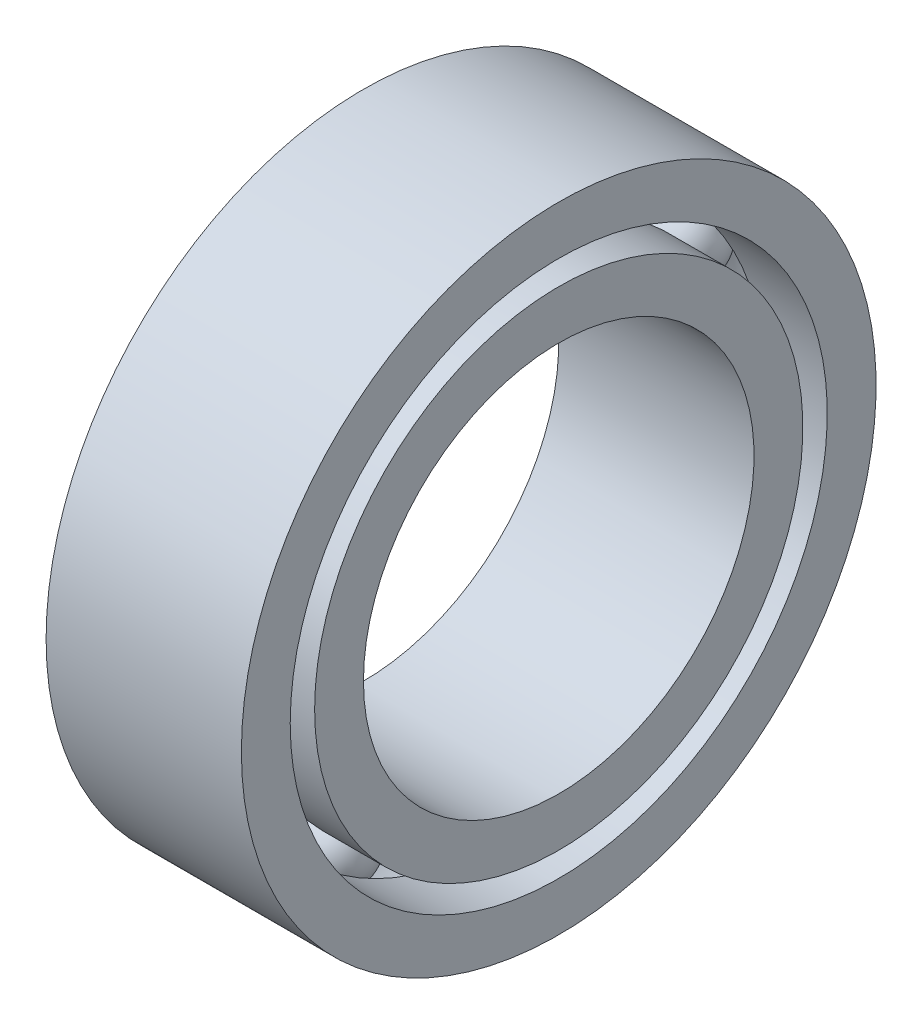
ISO-10303-21;
HEADER;
FILE_DESCRIPTION(('STEP AP214'),'2;1');
FILE_NAME('part.step','',(''),(''),'','','');
FILE_SCHEMA(('AUTOMOTIVE_DESIGN { 1 0 10303 214 1 1 1 1 }'));
ENDSEC;
DATA;
#1=APPLICATION_CONTEXT('core data for automotive mechanical design processes');
#2=APPLICATION_PROTOCOL_DEFINITION('international standard','automotive_design',2000,#1);
#3=PRODUCT_CONTEXT('',#1,'mechanical');
#4=PRODUCT('Part','Part','',(#3));
#5=PRODUCT_RELATED_PRODUCT_CATEGORY('part','',(#4));
#6=PRODUCT_DEFINITION_FORMATION('','',#4);
#7=PRODUCT_DEFINITION_CONTEXT('part definition',#1,'design');
#8=PRODUCT_DEFINITION('design','',#6,#7);
#9=PRODUCT_DEFINITION_SHAPE('','',#8);
#10=(LENGTH_UNIT() NAMED_UNIT(*) SI_UNIT(.MILLI.,.METRE.));
#11=(NAMED_UNIT(*) PLANE_ANGLE_UNIT() SI_UNIT($,.RADIAN.));
#12=(NAMED_UNIT(*) SI_UNIT($,.STERADIAN.) SOLID_ANGLE_UNIT());
#13=UNCERTAINTY_MEASURE_WITH_UNIT(LENGTH_MEASURE(1.E-05),#10,'distance_accuracy_value','');
#14=(GEOMETRIC_REPRESENTATION_CONTEXT(3) GLOBAL_UNCERTAINTY_ASSIGNED_CONTEXT((#13)) GLOBAL_UNIT_ASSIGNED_CONTEXT((#10,
#11,#12)) REPRESENTATION_CONTEXT('',''));
#15=CARTESIAN_POINT('',(0.,0.,0.));
#16=DIRECTION('',(0.,0.,1.));
#17=DIRECTION('',(1.,0.,0.));
#18=AXIS2_PLACEMENT_3D('',#15,#16,#17);
#19=CARTESIAN_POINT('',(0.00299787757857819,4.54663336986834,-2.62499999999994));
#20=DIRECTION('',(-1.,0.,0.));
#21=DIRECTION('',(0.,0.866025403784445,-0.499999999999989));
#22=AXIS2_PLACEMENT_3D('',#19,#20,#21);
#23=SPHERICAL_SURFACE('',#22,0.750000000000001);
#24=CARTESIAN_POINT('',(-0.747002122421422,4.54663336986834,-2.62499999999994));
#25=VERTEX_POINT('',#24);
#26=VERTEX_LOOP('',#25);
#27=FACE_BOUND('',#26,.T.);
#28=ADVANCED_FACE('F45',(#27),#23,.T.);
#29=CLOSED_SHELL('',(#28));
#30=MANIFOLD_SOLID_BREP('B2',#29);
#31=CARTESIAN_POINT('',(0.00299787757857819,2.62500000000005,-4.54663336986827));
#32=DIRECTION('',(-1.,0.,0.));
#33=DIRECTION('',(0.,0.50000000000001,-0.866025403784433));
#34=AXIS2_PLACEMENT_3D('',#31,#32,#33);
#35=SPHERICAL_SURFACE('',#34,0.750000000000001);
#36=CARTESIAN_POINT('',(-0.747002122421422,2.62500000000005,-4.54663336986827));
#37=VERTEX_POINT('',#36);
#38=VERTEX_LOOP('',#37);
#39=FACE_BOUND('',#38,.T.);
#40=ADVANCED_FACE('F63',(#39),#35,.T.);
#41=CLOSED_SHELL('',(#40));
#42=MANIFOLD_SOLID_BREP('B6',#41);
#43=CARTESIAN_POINT('',(0.00299787757857819,0.,-5.25));
#44=DIRECTION('',(-1.,0.,0.));
#45=DIRECTION('',(0.,0.,-1.));
#46=AXIS2_PLACEMENT_3D('',#43,#44,#45);
#47=SPHERICAL_SURFACE('',#46,0.750000000000001);
#48=CARTESIAN_POINT('',(-0.747002122421422,0.,-5.25));
#49=VERTEX_POINT('',#48);
#50=VERTEX_LOOP('',#49);
#51=FACE_BOUND('',#50,.T.);
#52=ADVANCED_FACE('F81',(#51),#47,.T.);
#53=CLOSED_SHELL('',(#52));
#54=MANIFOLD_SOLID_BREP('B41',#53);
#55=CARTESIAN_POINT('',(0.00299787757857819,-2.62499999999996,-4.54663336986833));
#56=DIRECTION('',(-1.,0.,0.));
#57=DIRECTION('',(0.,-0.499999999999992,-0.866025403784443));
#58=AXIS2_PLACEMENT_3D('',#55,#56,#57);
#59=SPHERICAL_SURFACE('',#58,0.750000000000001);
#60=CARTESIAN_POINT('',(-0.747002122421422,-2.62499999999996,-4.54663336986833));
#61=VERTEX_POINT('',#60);
#62=VERTEX_LOOP('',#61);
#63=FACE_BOUND('',#62,.T.);
#64=ADVANCED_FACE('F99',(#63),#59,.T.);
#65=CLOSED_SHELL('',(#64));
#66=MANIFOLD_SOLID_BREP('B59',#65);
#67=CARTESIAN_POINT('',(0.00299787757857819,-4.54663336986828,-2.62500000000004));
#68=DIRECTION('',(-1.,0.,0.));
#69=DIRECTION('',(0.,-0.866025403784435,-0.500000000000007));
#70=AXIS2_PLACEMENT_3D('',#67,#68,#69);
#71=SPHERICAL_SURFACE('',#70,0.750000000000001);
#72=CARTESIAN_POINT('',(-0.747002122421422,-4.54663336986828,-2.62500000000004));
#73=VERTEX_POINT('',#72);
#74=VERTEX_LOOP('',#73);
#75=FACE_BOUND('',#74,.T.);
#76=ADVANCED_FACE('F117',(#75),#71,.T.);
#77=CLOSED_SHELL('',(#76));
#78=MANIFOLD_SOLID_BREP('B77',#77);
#79=CARTESIAN_POINT('',(0.00299787757857819,-5.25,0.));
#80=DIRECTION('',(-1.,0.,0.));
#81=DIRECTION('',(0.,-1.,0.));
#82=AXIS2_PLACEMENT_3D('',#79,#80,#81);
#83=SPHERICAL_SURFACE('',#82,0.750000000000001);
#84=CARTESIAN_POINT('',(-0.747002122421422,-5.25,0.));
#85=VERTEX_POINT('',#84);
#86=VERTEX_LOOP('',#85);
#87=FACE_BOUND('',#86,.T.);
#88=ADVANCED_FACE('F135',(#87),#83,.T.);
#89=CLOSED_SHELL('',(#88));
#90=MANIFOLD_SOLID_BREP('B95',#89);
#91=CARTESIAN_POINT('',(0.00299787757857819,-4.54663336986832,2.62499999999997));
#92=DIRECTION('',(-1.,0.,0.));
#93=DIRECTION('',(0.,-0.866025403784442,0.499999999999995));
#94=AXIS2_PLACEMENT_3D('',#91,#92,#93);
#95=SPHERICAL_SURFACE('',#94,0.750000000000001);
#96=CARTESIAN_POINT('',(-0.747002122421422,-4.54663336986832,2.62499999999997));
#97=VERTEX_POINT('',#96);
#98=VERTEX_LOOP('',#97);
#99=FACE_BOUND('',#98,.T.);
#100=ADVANCED_FACE('F153',(#99),#95,.T.);
#101=CLOSED_SHELL('',(#100));
#102=MANIFOLD_SOLID_BREP('B113',#101);
#103=CARTESIAN_POINT('',(0.00299787757857819,-2.62500000000002,4.54663336986829));
#104=DIRECTION('',(-1.,0.,0.));
#105=DIRECTION('',(0.,-0.500000000000004,0.866025403784436));
#106=AXIS2_PLACEMENT_3D('',#103,#104,#105);
#107=SPHERICAL_SURFACE('',#106,0.750000000000001);
#108=CARTESIAN_POINT('',(-0.747002122421422,-2.62500000000002,4.54663336986829));
#109=VERTEX_POINT('',#108);
#110=VERTEX_LOOP('',#109);
#111=FACE_BOUND('',#110,.T.);
#112=ADVANCED_FACE('F171',(#111),#107,.T.);
#113=CLOSED_SHELL('',(#112));
#114=MANIFOLD_SOLID_BREP('B131',#113);
#115=CARTESIAN_POINT('',(0.00299787757857819,0.,5.25));
#116=DIRECTION('',(-1.,0.,0.));
#117=DIRECTION('',(0.,0.,1.));
#118=AXIS2_PLACEMENT_3D('',#115,#116,#117);
#119=SPHERICAL_SURFACE('',#118,0.750000000000001);
#120=CARTESIAN_POINT('',(-0.747002122421422,0.,5.25));
#121=VERTEX_POINT('',#120);
#122=VERTEX_LOOP('',#121);
#123=FACE_BOUND('',#122,.T.);
#124=ADVANCED_FACE('F190',(#123),#119,.T.);
#125=CLOSED_SHELL('',(#124));
#126=MANIFOLD_SOLID_BREP('B149',#125);
#127=CARTESIAN_POINT('',(0.00299787757857819,2.62499999999999,4.54663336986831));
#128=DIRECTION('',(-1.,0.,0.));
#129=DIRECTION('',(0.,0.499999999999998,0.86602540378444));
#130=AXIS2_PLACEMENT_3D('',#127,#128,#129);
#131=SPHERICAL_SURFACE('',#130,0.750000000000001);
#132=CARTESIAN_POINT('',(-0.747002122421422,2.62499999999999,4.54663336986831));
#133=VERTEX_POINT('',#132);
#134=VERTEX_LOOP('',#133);
#135=FACE_BOUND('',#134,.T.);
#136=ADVANCED_FACE('F211',(#135),#131,.T.);
#137=CLOSED_SHELL('',(#136));
#138=MANIFOLD_SOLID_BREP('B167',#137);
#139=CARTESIAN_POINT('',(0.00299787757857819,4.5466333698683,2.625));
#140=DIRECTION('',(-1.,0.,0.));
#141=DIRECTION('',(0.,0.866025403784438,0.500000000000001));
#142=AXIS2_PLACEMENT_3D('',#139,#140,#141);
#143=SPHERICAL_SURFACE('',#142,0.750000000000001);
#144=CARTESIAN_POINT('',(-0.747002122421422,4.5466333698683,2.625));
#145=VERTEX_POINT('',#144);
#146=VERTEX_LOOP('',#145);
#147=FACE_BOUND('',#146,.T.);
#148=ADVANCED_FACE('F229',(#147),#143,.T.);
#149=CLOSED_SHELL('',(#148));
#150=MANIFOLD_SOLID_BREP('B186',#149);
#151=CARTESIAN_POINT('',(0.00299787757857819,5.25,0.));
#152=DIRECTION('',(-1.,0.,0.));
#153=DIRECTION('',(0.,1.,0.));
#154=AXIS2_PLACEMENT_3D('',#151,#152,#153);
#155=SPHERICAL_SURFACE('',#154,0.750000000000001);
#156=CARTESIAN_POINT('',(-0.747002122421422,5.25,0.));
#157=VERTEX_POINT('',#156);
#158=VERTEX_LOOP('',#157);
#159=FACE_BOUND('',#158,.T.);
#160=ADVANCED_FACE('F251',(#159),#155,.T.);
#161=CLOSED_SHELL('',(#160));
#162=MANIFOLD_SOLID_BREP('B207',#161);
#163=CARTESIAN_POINT('',(0.,0.,0.));
#164=DIRECTION('',(-1.,0.,0.));
#165=DIRECTION('',(0.,0.,1.));
#166=AXIS2_PLACEMENT_3D('',#163,#164,#165);
#167=CYLINDRICAL_SURFACE('',#166,5.);
#168=CARTESIAN_POINT('',(-1.99700212242142,0.,0.));
#169=DIRECTION('',(-1.,0.,0.));
#170=DIRECTION('',(0.,0.,1.));
#171=AXIS2_PLACEMENT_3D('',#168,#169,#170);
#172=CIRCLE('',#171,5.);
#173=CARTESIAN_POINT('',(-1.99700212242142,0.,5.));
#174=VERTEX_POINT('',#173);
#175=EDGE_CURVE('E250',#174,#174,#172,.T.);
#176=ORIENTED_EDGE('',*,*,#175,.F.);
#177=EDGE_LOOP('',(#176));
#178=FACE_BOUND('',#177,.T.);
#179=CARTESIAN_POINT('',(-0.70410890360797,0.,0.));
#180=DIRECTION('',(-1.,0.,0.));
#181=DIRECTION('',(0.,0.,1.));
#182=AXIS2_PLACEMENT_3D('',#179,#180,#181);
#183=CIRCLE('',#182,5.);
#184=CARTESIAN_POINT('',(-0.70410890360797,0.,5.));
#185=VERTEX_POINT('',#184);
#186=EDGE_CURVE('E300',#185,#185,#183,.T.);
#187=ORIENTED_EDGE('',*,*,#186,.T.);
#188=EDGE_LOOP('',(#187));
#189=FACE_BOUND('',#188,.T.);
#190=ADVANCED_FACE('F278',(#178,#189),#167,.T.);
#191=CARTESIAN_POINT('',(-1.99700212242142,4.,0.));
#192=DIRECTION('',(1.,0.,0.));
#193=DIRECTION('',(0.,0.,-1.));
#194=AXIS2_PLACEMENT_3D('',#191,#192,#193);
#195=PLANE('',#194);
#196=CARTESIAN_POINT('',(-1.99700212242142,0.,0.));
#197=DIRECTION('',(-1.,0.,0.));
#198=DIRECTION('',(0.,0.,1.));
#199=AXIS2_PLACEMENT_3D('',#196,#197,#198);
#200=CIRCLE('',#199,4.);
#201=CARTESIAN_POINT('',(-1.99700212242142,0.,4.));
#202=VERTEX_POINT('',#201);
#203=EDGE_CURVE('E284',#202,#202,#200,.T.);
#204=ORIENTED_EDGE('',*,*,#203,.F.);
#205=EDGE_LOOP('',(#204));
#206=FACE_BOUND('',#205,.T.);
#207=ORIENTED_EDGE('',*,*,#175,.T.);
#208=EDGE_LOOP('',(#207));
#209=FACE_BOUND('',#208,.T.);
#210=ADVANCED_FACE('F317',(#206,#209),#195,.F.);
#211=CARTESIAN_POINT('',(0.,0.,0.));
#212=DIRECTION('',(-1.,0.,0.));
#213=DIRECTION('',(0.,0.,1.));
#214=AXIS2_PLACEMENT_3D('',#211,#212,#213);
#215=CYLINDRICAL_SURFACE('',#214,4.);
#216=CARTESIAN_POINT('',(2.00299787757858,0.,0.));
#217=DIRECTION('',(-1.,0.,0.));
#218=DIRECTION('',(0.,0.,1.));
#219=AXIS2_PLACEMENT_3D('',#216,#217,#218);
#220=CIRCLE('',#219,4.);
#221=CARTESIAN_POINT('',(2.00299787757858,0.,4.));
#222=VERTEX_POINT('',#221);
#223=EDGE_CURVE('E288',#222,#222,#220,.T.);
#224=ORIENTED_EDGE('',*,*,#223,.F.);
#225=EDGE_LOOP('',(#224));
#226=FACE_BOUND('',#225,.T.);
#227=ORIENTED_EDGE('',*,*,#203,.T.);
#228=EDGE_LOOP('',(#227));
#229=FACE_BOUND('',#228,.T.);
#230=ADVANCED_FACE('F322',(#226,#229),#215,.F.);
#231=CARTESIAN_POINT('',(2.00299787757858,5.,0.));
#232=DIRECTION('',(-1.,0.,0.));
#233=DIRECTION('',(0.,0.,1.));
#234=AXIS2_PLACEMENT_3D('',#231,#232,#233);
#235=PLANE('',#234);
#236=CARTESIAN_POINT('',(2.00299787757858,0.,0.));
#237=DIRECTION('',(-1.,0.,0.));
#238=DIRECTION('',(0.,0.,1.));
#239=AXIS2_PLACEMENT_3D('',#236,#237,#238);
#240=CIRCLE('',#239,5.);
#241=CARTESIAN_POINT('',(2.00299787757858,0.,5.));
#242=VERTEX_POINT('',#241);
#243=EDGE_CURVE('E292',#242,#242,#240,.T.);
#244=ORIENTED_EDGE('',*,*,#243,.F.);
#245=EDGE_LOOP('',(#244));
#246=FACE_BOUND('',#245,.T.);
#247=ORIENTED_EDGE('',*,*,#223,.T.);
#248=EDGE_LOOP('',(#247));
#249=FACE_BOUND('',#248,.T.);
#250=ADVANCED_FACE('F313',(#246,#249),#235,.F.);
#251=CARTESIAN_POINT('',(0.,0.,0.));
#252=DIRECTION('',(-1.,0.,0.));
#253=DIRECTION('',(0.,0.,1.));
#254=AXIS2_PLACEMENT_3D('',#251,#252,#253);
#255=CYLINDRICAL_SURFACE('',#254,5.);
#256=CARTESIAN_POINT('',(0.710104658765126,0.,0.));
#257=DIRECTION('',(-1.,0.,0.));
#258=DIRECTION('',(0.,0.,1.));
#259=AXIS2_PLACEMENT_3D('',#256,#257,#258);
#260=CIRCLE('',#259,5.);
#261=CARTESIAN_POINT('',(0.710104658765126,0.,5.));
#262=VERTEX_POINT('',#261);
#263=EDGE_CURVE('E297',#262,#262,#260,.T.);
#264=ORIENTED_EDGE('',*,*,#263,.F.);
#265=EDGE_LOOP('',(#264));
#266=FACE_BOUND('',#265,.T.);
#267=ORIENTED_EDGE('',*,*,#243,.T.);
#268=EDGE_LOOP('',(#267));
#269=FACE_BOUND('',#268,.T.);
#270=ADVANCED_FACE('F307',(#266,#269),#255,.T.);
#271=CARTESIAN_POINT('',(0.00299787757857819,0.,0.));
#272=DIRECTION('',(-1.,0.,0.));
#273=DIRECTION('',(0.,0.,1.));
#274=AXIS2_PLACEMENT_3D('',#271,#272,#273);
#275=TOROIDAL_SURFACE('',#274,5.25,0.75);
#276=ORIENTED_EDGE('',*,*,#263,.T.);
#277=EDGE_LOOP('',(#276));
#278=FACE_BOUND('',#277,.T.);
#279=ORIENTED_EDGE('',*,*,#186,.F.);
#280=EDGE_LOOP('',(#279));
#281=FACE_BOUND('',#280,.T.);
#282=ADVANCED_FACE('F305',(#278,#281),#275,.F.);
#283=CLOSED_SHELL('',(#190,#210,#230,#250,#270,#282));
#284=MANIFOLD_SOLID_BREP('B225',#283);
#285=CARTESIAN_POINT('',(-1.99700212242142,5.5,0.));
#286=DIRECTION('',(1.,0.,0.));
#287=DIRECTION('',(0.,0.,-1.));
#288=AXIS2_PLACEMENT_3D('',#285,#286,#287);
#289=PLANE('',#288);
#290=CARTESIAN_POINT('',(-1.99700212242142,0.,0.));
#291=DIRECTION('',(-1.,0.,0.));
#292=DIRECTION('',(0.,0.,1.));
#293=AXIS2_PLACEMENT_3D('',#290,#291,#292);
#294=CIRCLE('',#293,5.5);
#295=CARTESIAN_POINT('',(-1.99700212242142,0.,5.5));
#296=VERTEX_POINT('',#295);
#297=EDGE_CURVE('E384',#296,#296,#294,.T.);
#298=ORIENTED_EDGE('',*,*,#297,.F.);
#299=EDGE_LOOP('',(#298));
#300=FACE_BOUND('',#299,.T.);
#301=CARTESIAN_POINT('',(-1.99700212242142,0.,0.));
#302=DIRECTION('',(-1.,0.,0.));
#303=DIRECTION('',(0.,0.,1.));
#304=AXIS2_PLACEMENT_3D('',#301,#302,#303);
#305=CIRCLE('',#304,6.5);
#306=CARTESIAN_POINT('',(-1.99700212242142,0.,6.5));
#307=VERTEX_POINT('',#306);
#308=EDGE_CURVE('E277',#307,#307,#305,.T.);
#309=ORIENTED_EDGE('',*,*,#308,.T.);
#310=EDGE_LOOP('',(#309));
#311=FACE_BOUND('',#310,.T.);
#312=ADVANCED_FACE('F378',(#300,#311),#289,.F.);
#313=CARTESIAN_POINT('',(0.,0.,0.));
#314=DIRECTION('',(-1.,0.,0.));
#315=DIRECTION('',(0.,0.,1.));
#316=AXIS2_PLACEMENT_3D('',#313,#314,#315);
#317=CYLINDRICAL_SURFACE('',#316,5.5);
#318=CARTESIAN_POINT('',(-0.704108903607969,0.,0.));
#319=DIRECTION('',(-1.,0.,0.));
#320=DIRECTION('',(0.,0.,1.));
#321=AXIS2_PLACEMENT_3D('',#318,#319,#320);
#322=CIRCLE('',#321,5.5);
#323=CARTESIAN_POINT('',(-0.704108903607969,0.,5.5));
#324=VERTEX_POINT('',#323);
#325=EDGE_CURVE('E388',#324,#324,#322,.T.);
#326=ORIENTED_EDGE('',*,*,#325,.F.);
#327=EDGE_LOOP('',(#326));
#328=FACE_BOUND('',#327,.T.);
#329=ORIENTED_EDGE('',*,*,#297,.T.);
#330=EDGE_LOOP('',(#329));
#331=FACE_BOUND('',#330,.T.);
#332=ADVANCED_FACE('F420',(#328,#331),#317,.F.);
#333=CARTESIAN_POINT('',(0.00299787757857819,0.,0.));
#334=DIRECTION('',(-1.,0.,0.));
#335=DIRECTION('',(0.,0.,1.));
#336=AXIS2_PLACEMENT_3D('',#333,#334,#335);
#337=TOROIDAL_SURFACE('',#336,5.25,0.75);
#338=ORIENTED_EDGE('',*,*,#325,.T.);
#339=EDGE_LOOP('',(#338));
#340=FACE_BOUND('',#339,.T.);
#341=CARTESIAN_POINT('',(0.710104658765126,0.,0.));
#342=DIRECTION('',(-1.,0.,0.));
#343=DIRECTION('',(0.,0.,1.));
#344=AXIS2_PLACEMENT_3D('',#341,#342,#343);
#345=CIRCLE('',#344,5.5);
#346=CARTESIAN_POINT('',(0.710104658765126,0.,5.5));
#347=VERTEX_POINT('',#346);
#348=EDGE_CURVE('E392',#347,#347,#345,.T.);
#349=ORIENTED_EDGE('',*,*,#348,.F.);
#350=EDGE_LOOP('',(#349));
#351=FACE_BOUND('',#350,.T.);
#352=ADVANCED_FACE('F415',(#340,#351),#337,.F.);
#353=CARTESIAN_POINT('',(0.,0.,0.));
#354=DIRECTION('',(-1.,0.,0.));
#355=DIRECTION('',(0.,0.,1.));
#356=AXIS2_PLACEMENT_3D('',#353,#354,#355);
#357=CYLINDRICAL_SURFACE('',#356,5.5);
#358=CARTESIAN_POINT('',(2.00299787757858,0.,0.));
#359=DIRECTION('',(-1.,0.,0.));
#360=DIRECTION('',(0.,0.,1.));
#361=AXIS2_PLACEMENT_3D('',#358,#359,#360);
#362=CIRCLE('',#361,5.5);
#363=CARTESIAN_POINT('',(2.00299787757858,0.,5.5));
#364=VERTEX_POINT('',#363);
#365=EDGE_CURVE('E397',#364,#364,#362,.T.);
#366=ORIENTED_EDGE('',*,*,#365,.F.);
#367=EDGE_LOOP('',(#366));
#368=FACE_BOUND('',#367,.T.);
#369=ORIENTED_EDGE('',*,*,#348,.T.);
#370=EDGE_LOOP('',(#369));
#371=FACE_BOUND('',#370,.T.);
#372=ADVANCED_FACE('F409',(#368,#371),#357,.F.);
#373=CARTESIAN_POINT('',(2.00299787757858,6.5,0.));
#374=DIRECTION('',(-1.,0.,0.));
#375=DIRECTION('',(0.,0.,1.));
#376=AXIS2_PLACEMENT_3D('',#373,#374,#375);
#377=PLANE('',#376);
#378=CARTESIAN_POINT('',(2.00299787757858,0.,0.));
#379=DIRECTION('',(-1.,0.,0.));
#380=DIRECTION('',(0.,0.,1.));
#381=AXIS2_PLACEMENT_3D('',#378,#379,#380);
#382=CIRCLE('',#381,6.5);
#383=CARTESIAN_POINT('',(2.00299787757858,0.,6.5));
#384=VERTEX_POINT('',#383);
#385=EDGE_CURVE('E400',#384,#384,#382,.T.);
#386=ORIENTED_EDGE('',*,*,#385,.F.);
#387=EDGE_LOOP('',(#386));
#388=FACE_BOUND('',#387,.T.);
#389=ORIENTED_EDGE('',*,*,#365,.T.);
#390=EDGE_LOOP('',(#389));
#391=FACE_BOUND('',#390,.T.);
#392=ADVANCED_FACE('F406',(#388,#391),#377,.F.);
#393=CARTESIAN_POINT('',(0.,0.,0.));
#394=DIRECTION('',(-1.,0.,0.));
#395=DIRECTION('',(0.,0.,1.));
#396=AXIS2_PLACEMENT_3D('',#393,#394,#395);
#397=CYLINDRICAL_SURFACE('',#396,6.5);
#398=ORIENTED_EDGE('',*,*,#308,.F.);
#399=EDGE_LOOP('',(#398));
#400=FACE_BOUND('',#399,.T.);
#401=ORIENTED_EDGE('',*,*,#385,.T.);
#402=EDGE_LOOP('',(#401));
#403=FACE_BOUND('',#402,.T.);
#404=ADVANCED_FACE('F404',(#400,#403),#397,.T.);
#405=CLOSED_SHELL('',(#312,#332,#352,#372,#392,#404));
#406=MANIFOLD_SOLID_BREP('B245',#405);
#407=ADVANCED_BREP_SHAPE_REPRESENTATION('',(#18,#30,#42,#54,#66,#78,#90,#102,#114,#126,#138,
#150,#162,#284,#406),#14);
#408=SHAPE_DEFINITION_REPRESENTATION(#9,#407);
ENDSEC;
END-ISO-10303-21;
